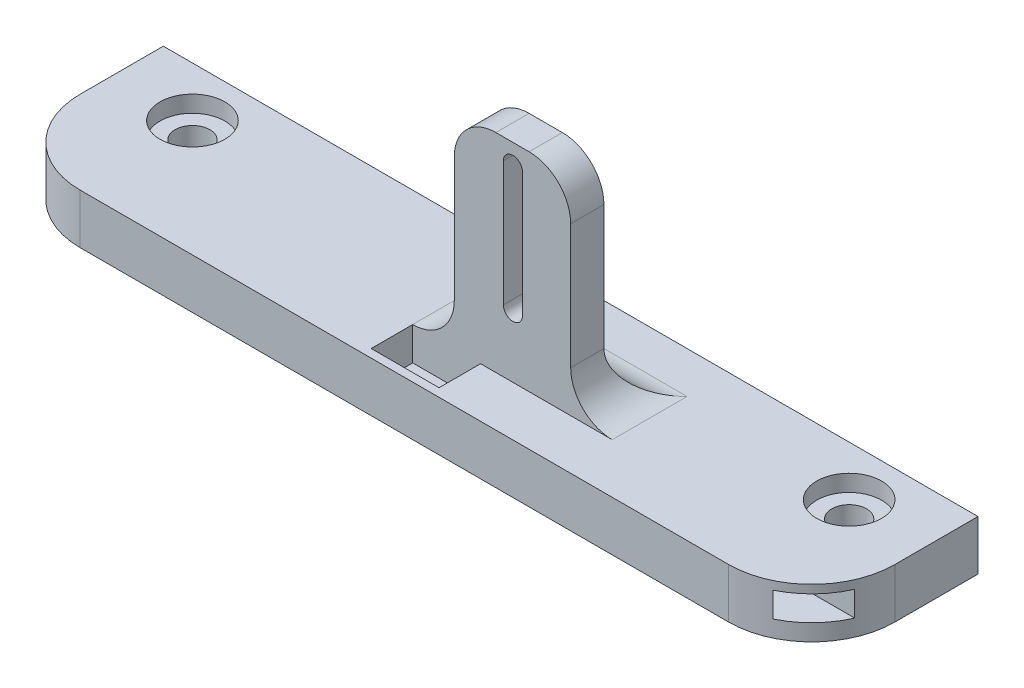
ISO-10303-21;
HEADER;
FILE_DESCRIPTION(('STEP AP214'),'2;1');
FILE_NAME('part.step','',(''),(''),'','','');
FILE_SCHEMA(('AUTOMOTIVE_DESIGN { 1 0 10303 214 1 1 1 1 }'));
ENDSEC;
DATA;
#1=APPLICATION_CONTEXT('core data for automotive mechanical design processes');
#2=APPLICATION_PROTOCOL_DEFINITION('international standard','automotive_design',2000,#1);
#3=PRODUCT_CONTEXT('',#1,'mechanical');
#4=PRODUCT('Part','Part','',(#3));
#5=PRODUCT_RELATED_PRODUCT_CATEGORY('part','',(#4));
#6=PRODUCT_DEFINITION_FORMATION('','',#4);
#7=PRODUCT_DEFINITION_CONTEXT('part definition',#1,'design');
#8=PRODUCT_DEFINITION('design','',#6,#7);
#9=PRODUCT_DEFINITION_SHAPE('','',#8);
#10=(LENGTH_UNIT() NAMED_UNIT(*) SI_UNIT(.MILLI.,.METRE.));
#11=(NAMED_UNIT(*) PLANE_ANGLE_UNIT() SI_UNIT($,.RADIAN.));
#12=(NAMED_UNIT(*) SI_UNIT($,.STERADIAN.) SOLID_ANGLE_UNIT());
#13=UNCERTAINTY_MEASURE_WITH_UNIT(LENGTH_MEASURE(1.E-05),#10,'distance_accuracy_value','');
#14=(GEOMETRIC_REPRESENTATION_CONTEXT(3) GLOBAL_UNCERTAINTY_ASSIGNED_CONTEXT((#13)) GLOBAL_UNIT_ASSIGNED_CONTEXT((#10,
#11,#12)) REPRESENTATION_CONTEXT('',''));
#15=CARTESIAN_POINT('',(0.,0.,0.));
#16=DIRECTION('',(0.,0.,1.));
#17=DIRECTION('',(1.,0.,0.));
#18=AXIS2_PLACEMENT_3D('',#15,#16,#17);
#19=CARTESIAN_POINT('',(48.1651513899117,5.00340782826925,8.99999999999998));
#20=DIRECTION('',(0.,1.,0.));
#21=DIRECTION('',(-1.,0.,0.));
#22=AXIS2_PLACEMENT_3D('',#19,#20,#21);
#23=PLANE('',#22);
#24=DIRECTION('',(1.,0.,0.));
#25=VECTOR('',#24,1.);
#26=CARTESIAN_POINT('',(48.1651513899117,5.00340782826925,3.99999999999999));
#27=LINE('',#26,#25);
#28=CARTESIAN_POINT('',(3.16515138991173,5.00340782826924,3.99999999999999));
#29=VERTEX_POINT('',#28);
#30=CARTESIAN_POINT('',(48.1651513899117,5.00340782826925,3.99999999999993));
#31=VERTEX_POINT('',#30);
#32=EDGE_CURVE('E200',#29,#31,#27,.T.);
#33=ORIENTED_EDGE('',*,*,#32,.T.);
#34=CARTESIAN_POINT('',(39.,5.00340782826925,0.));
#35=DIRECTION('',(0.,1.,0.));
#36=DIRECTION('',(-1.,0.,0.));
#37=AXIS2_PLACEMENT_3D('',#34,#35,#36);
#38=CIRCLE('',#37,10.);
#39=CARTESIAN_POINT('',(43.3588989435407,5.00340782826925,8.99999999999997));
#40=VERTEX_POINT('',#39);
#41=EDGE_CURVE('E54',#31,#40,#38,.F.);
#42=ORIENTED_EDGE('',*,*,#41,.T.);
#43=DIRECTION('',(1.,0.,0.));
#44=VECTOR('',#43,1.);
#45=CARTESIAN_POINT('',(48.1651513899117,5.00340782826925,8.99999999999998));
#46=LINE('',#45,#44);
#47=CARTESIAN_POINT('',(3.16515138991173,5.00340782826924,8.99999999999998));
#48=VERTEX_POINT('',#47);
#49=EDGE_CURVE('E198',#48,#40,#46,.T.);
#50=ORIENTED_EDGE('',*,*,#49,.F.);
#51=DIRECTION('',(0.,0.,-1.));
#52=VECTOR('',#51,1.);
#53=CARTESIAN_POINT('',(3.16515138991173,5.00340782826924,8.99999999999998));
#54=LINE('',#53,#52);
#55=EDGE_CURVE('E212',#48,#29,#54,.T.);
#56=ORIENTED_EDGE('',*,*,#55,.T.);
#57=EDGE_LOOP('',(#33,#42,#50,#56));
#58=FACE_BOUND('',#57,.T.);
#59=ADVANCED_FACE('F39',(#58),#23,.F.);
#60=CARTESIAN_POINT('',(14.,31.,3.99999999999999));
#61=DIRECTION('',(0.,0.,-1.));
#62=DIRECTION('',(-1.,0.,0.));
#63=AXIS2_PLACEMENT_3D('',#60,#61,#62);
#64=PLANE('',#63);
#65=DIRECTION('',(0.,1.,0.));
#66=VECTOR('',#65,1.);
#67=CARTESIAN_POINT('',(5.9,28.5,3.9999999999999));
#68=LINE('',#67,#66);
#69=CARTESIAN_POINT('',(5.9,13.5,3.9999999999999));
#70=VERTEX_POINT('',#69);
#71=CARTESIAN_POINT('',(5.9,28.5,3.9999999999999));
#72=VERTEX_POINT('',#71);
#73=EDGE_CURVE('E406',#70,#72,#68,.T.);
#74=ORIENTED_EDGE('',*,*,#73,.T.);
#75=CARTESIAN_POINT('',(7.05000000000001,28.5,3.9999999999999));
#76=DIRECTION('',(0.,0.,-1.));
#77=DIRECTION('',(-1.,0.,0.));
#78=AXIS2_PLACEMENT_3D('',#75,#76,#77);
#79=CIRCLE('',#78,1.15);
#80=CARTESIAN_POINT('',(8.2,28.5,3.9999999999999));
#81=VERTEX_POINT('',#80);
#82=EDGE_CURVE('E418',#72,#81,#79,.T.);
#83=ORIENTED_EDGE('',*,*,#82,.T.);
#84=DIRECTION('',(0.,-1.,0.));
#85=VECTOR('',#84,1.);
#86=CARTESIAN_POINT('',(8.2,28.5,3.9999999999999));
#87=LINE('',#86,#85);
#88=CARTESIAN_POINT('',(8.2,13.5,3.99999999999999));
#89=VERTEX_POINT('',#88);
#90=EDGE_CURVE('E437',#81,#89,#87,.T.);
#91=ORIENTED_EDGE('',*,*,#90,.T.);
#92=CARTESIAN_POINT('',(7.05,13.5,3.9999999999999));
#93=DIRECTION('',(0.,0.,-1.));
#94=DIRECTION('',(-1.,0.,0.));
#95=AXIS2_PLACEMENT_3D('',#92,#93,#94);
#96=CIRCLE('',#95,1.15);
#97=EDGE_CURVE('E433',#89,#70,#96,.T.);
#98=ORIENTED_EDGE('',*,*,#97,.T.);
#99=EDGE_LOOP('',(#74,#83,#91,#98));
#100=FACE_BOUND('',#99,.T.);
#101=DIRECTION('',(-1.,0.,0.));
#102=VECTOR('',#101,1.);
#103=CARTESIAN_POINT('',(3.16515138991173,6.,3.99999999999999));
#104=LINE('',#103,#102);
#105=CARTESIAN_POINT('',(19.,6.,3.99999999999999));
#106=VERTEX_POINT('',#105);
#107=CARTESIAN_POINT('',(3.16515138991173,6.,3.99999999999999));
#108=VERTEX_POINT('',#107);
#109=EDGE_CURVE('E203',#106,#108,#104,.T.);
#110=ORIENTED_EDGE('',*,*,#109,.F.);
#111=CARTESIAN_POINT('',(19.,11.,3.99999999999999));
#112=DIRECTION('',(0.,0.,-1.));
#113=DIRECTION('',(-1.,0.,0.));
#114=AXIS2_PLACEMENT_3D('',#111,#112,#113);
#115=CIRCLE('',#114,5.);
#116=CARTESIAN_POINT('',(14.,11.,3.99999999999999));
#117=VERTEX_POINT('',#116);
#118=EDGE_CURVE('E259',#117,#106,#115,.F.);
#119=ORIENTED_EDGE('',*,*,#118,.F.);
#120=DIRECTION('',(0.,-1.,0.));
#121=VECTOR('',#120,1.);
#122=CARTESIAN_POINT('',(14.,31.,3.99999999999999));
#123=LINE('',#122,#121);
#124=CARTESIAN_POINT('',(14.,26.,3.99999999999999));
#125=VERTEX_POINT('',#124);
#126=EDGE_CURVE('E387',#125,#117,#123,.T.);
#127=ORIENTED_EDGE('',*,*,#126,.F.);
#128=CARTESIAN_POINT('',(8.99999999999999,26.,3.99999999999999));
#129=DIRECTION('',(0.,0.,-1.));
#130=DIRECTION('',(-1.,0.,0.));
#131=AXIS2_PLACEMENT_3D('',#128,#129,#130);
#132=CIRCLE('',#131,5.);
#133=CARTESIAN_POINT('',(8.99999999999999,31.,3.99999999999999));
#134=VERTEX_POINT('',#133);
#135=EDGE_CURVE('E238',#125,#134,#132,.F.);
#136=ORIENTED_EDGE('',*,*,#135,.T.);
#137=DIRECTION('',(1.,0.,0.));
#138=VECTOR('',#137,1.);
#139=CARTESIAN_POINT('',(14.,31.,3.99999999999999));
#140=LINE('',#139,#138);
#141=CARTESIAN_POINT('',(5.,31.,3.99999999999999));
#142=VERTEX_POINT('',#141);
#143=EDGE_CURVE('E393',#142,#134,#140,.T.);
#144=ORIENTED_EDGE('',*,*,#143,.F.);
#145=CARTESIAN_POINT('',(5.,26.,3.99999999999999));
#146=DIRECTION('',(0.,0.,-1.));
#147=DIRECTION('',(-1.,0.,0.));
#148=AXIS2_PLACEMENT_3D('',#145,#146,#147);
#149=CIRCLE('',#148,5.);
#150=CARTESIAN_POINT('',(0.,26.,3.99999999999999));
#151=VERTEX_POINT('',#150);
#152=EDGE_CURVE('E218',#142,#151,#149,.F.);
#153=ORIENTED_EDGE('',*,*,#152,.T.);
#154=DIRECTION('',(0.,-1.,0.));
#155=VECTOR('',#154,1.);
#156=CARTESIAN_POINT('',(0.,31.,3.99999999999999));
#157=LINE('',#156,#155);
#158=CARTESIAN_POINT('',(0.,11.,3.99999999999999));
#159=VERTEX_POINT('',#158);
#160=EDGE_CURVE('E383',#151,#159,#157,.T.);
#161=ORIENTED_EDGE('',*,*,#160,.T.);
#162=CARTESIAN_POINT('',(-5.,11.,3.99999999999999));
#163=DIRECTION('',(0.,0.,-1.));
#164=DIRECTION('',(-1.,0.,0.));
#165=AXIS2_PLACEMENT_3D('',#162,#163,#164);
#166=CIRCLE('',#165,5.);
#167=CARTESIAN_POINT('',(-5.00000000000001,6.,3.99999999999993));
#168=VERTEX_POINT('',#167);
#169=EDGE_CURVE('E250',#168,#159,#166,.F.);
#170=ORIENTED_EDGE('',*,*,#169,.F.);
#171=DIRECTION('',(0.,1.,0.));
#172=VECTOR('',#171,1.);
#173=CARTESIAN_POINT('',(-5.00000000000001,10.,3.99999999999993));
#174=LINE('',#173,#172);
#175=CARTESIAN_POINT('',(-5.00000000000001,2.,3.99999999999993));
#176=VERTEX_POINT('',#175);
#177=EDGE_CURVE('E464',#176,#168,#174,.T.);
#178=ORIENTED_EDGE('',*,*,#177,.F.);
#179=DIRECTION('',(1.,0.,0.));
#180=VECTOR('',#179,1.);
#181=CARTESIAN_POINT('',(-5.00000000000001,2.,3.99999999999993));
#182=LINE('',#181,#180);
#183=CARTESIAN_POINT('',(48.1651513899117,2.,3.99999999999993));
#184=VERTEX_POINT('',#183);
#185=EDGE_CURVE('E450',#176,#184,#182,.T.);
#186=ORIENTED_EDGE('',*,*,#185,.T.);
#187=DIRECTION('',(0.,-1.,0.));
#188=VECTOR('',#187,1.);
#189=CARTESIAN_POINT('',(48.1651513899117,6.,3.99999999999993));
#190=LINE('',#189,#188);
#191=EDGE_CURVE('E11',#31,#184,#190,.T.);
#192=ORIENTED_EDGE('',*,*,#191,.F.);
#193=ORIENTED_EDGE('',*,*,#32,.F.);
#194=DIRECTION('',(0.,-1.,0.));
#195=VECTOR('',#194,1.);
#196=CARTESIAN_POINT('',(3.16515138991173,5.00340782826924,3.99999999999999));
#197=LINE('',#196,#195);
#198=EDGE_CURVE('E475',#108,#29,#197,.T.);
#199=ORIENTED_EDGE('',*,*,#198,.F.);
#200=EDGE_LOOP('',(#110,#119,#127,#136,#144,#153,#161,#170,#178,#186,#192,#193,#199));
#201=FACE_BOUND('',#200,.T.);
#202=ADVANCED_FACE('F491',(#100,#201),#64,.F.);
#203=CARTESIAN_POINT('',(-5.00000000000001,10.,8.99999999999993));
#204=DIRECTION('',(0.,0.,1.));
#205=DIRECTION('',(0.,-1.,0.));
#206=AXIS2_PLACEMENT_3D('',#203,#204,#205);
#207=PLANE('',#206);
#208=DIRECTION('',(0.,-1.,0.));
#209=VECTOR('',#208,1.);
#210=CARTESIAN_POINT('',(3.16515138991173,5.00340782826924,8.99999999999998));
#211=LINE('',#210,#209);
#212=CARTESIAN_POINT('',(3.16515138991173,6.,8.99999999999993));
#213=VERTEX_POINT('',#212);
#214=EDGE_CURVE('E209',#213,#48,#211,.T.);
#215=ORIENTED_EDGE('',*,*,#214,.T.);
#216=ORIENTED_EDGE('',*,*,#49,.T.);
#217=DIRECTION('',(0.,-1.,0.));
#218=VECTOR('',#217,1.);
#219=CARTESIAN_POINT('',(43.3588989435408,6.,8.99999999999993));
#220=LINE('',#219,#218);
#221=CARTESIAN_POINT('',(43.3588989435408,2.,8.99999999999993));
#222=VERTEX_POINT('',#221);
#223=EDGE_CURVE('E207',#222,#40,#220,.F.);
#224=ORIENTED_EDGE('',*,*,#223,.F.);
#225=DIRECTION('',(1.,0.,0.));
#226=VECTOR('',#225,1.);
#227=CARTESIAN_POINT('',(-5.00000000000001,2.,8.99999999999993));
#228=LINE('',#227,#226);
#229=CARTESIAN_POINT('',(-5.00000000000001,2.,8.99999999999993));
#230=VERTEX_POINT('',#229);
#231=EDGE_CURVE('E451',#230,#222,#228,.T.);
#232=ORIENTED_EDGE('',*,*,#231,.F.);
#233=DIRECTION('',(0.,-1.,0.));
#234=VECTOR('',#233,1.);
#235=CARTESIAN_POINT('',(-5.00000000000001,10.,8.99999999999993));
#236=LINE('',#235,#234);
#237=CARTESIAN_POINT('',(-5.00000000000001,6.,8.99999999999993));
#238=VERTEX_POINT('',#237);
#239=EDGE_CURVE('E461',#238,#230,#236,.T.);
#240=ORIENTED_EDGE('',*,*,#239,.F.);
#241=DIRECTION('',(-1.,0.,0.));
#242=VECTOR('',#241,1.);
#243=CARTESIAN_POINT('',(-39.,6.,8.99999999999993));
#244=LINE('',#243,#242);
#245=EDGE_CURVE('E62',#213,#238,#244,.T.);
#246=ORIENTED_EDGE('',*,*,#245,.F.);
#247=EDGE_LOOP('',(#215,#216,#224,#232,#240,#246));
#248=FACE_BOUND('',#247,.T.);
#249=ADVANCED_FACE('F205',(#248),#207,.F.);
#250=CARTESIAN_POINT('',(5.,26.,0.));
#251=DIRECTION('',(0.,0.,1.));
#252=DIRECTION('',(1.,0.,0.));
#253=AXIS2_PLACEMENT_3D('',#250,#251,#252);
#254=CYLINDRICAL_SURFACE('',#253,5.);
#255=DIRECTION('',(0.,0.,1.));
#256=VECTOR('',#255,1.);
#257=CARTESIAN_POINT('',(5.,31.,0.));
#258=LINE('',#257,#256);
#259=CARTESIAN_POINT('',(5.,31.,0.));
#260=VERTEX_POINT('',#259);
#261=EDGE_CURVE('E231',#260,#142,#258,.T.);
#262=ORIENTED_EDGE('',*,*,#261,.F.);
#263=CARTESIAN_POINT('',(5.,26.,0.));
#264=DIRECTION('',(0.,0.,1.));
#265=DIRECTION('',(1.,0.,0.));
#266=AXIS2_PLACEMENT_3D('',#263,#264,#265);
#267=CIRCLE('',#266,5.);
#268=CARTESIAN_POINT('',(0.,26.,0.));
#269=VERTEX_POINT('',#268);
#270=EDGE_CURVE('E222',#269,#260,#267,.F.);
#271=ORIENTED_EDGE('',*,*,#270,.F.);
#272=DIRECTION('',(0.,0.,1.));
#273=VECTOR('',#272,1.);
#274=CARTESIAN_POINT('',(0.,26.,3.99999999999999));
#275=LINE('',#274,#273);
#276=EDGE_CURVE('E227',#151,#269,#275,.F.);
#277=ORIENTED_EDGE('',*,*,#276,.F.);
#278=ORIENTED_EDGE('',*,*,#152,.F.);
#279=EDGE_LOOP('',(#262,#271,#277,#278));
#280=FACE_BOUND('',#279,.T.);
#281=ADVANCED_FACE('F41',(#280),#254,.T.);
#282=CARTESIAN_POINT('',(9.,26.,0.));
#283=DIRECTION('',(0.,0.,-1.));
#284=DIRECTION('',(-1.,0.,0.));
#285=AXIS2_PLACEMENT_3D('',#282,#283,#284);
#286=CYLINDRICAL_SURFACE('',#285,5.);
#287=DIRECTION('',(0.,0.,-1.));
#288=VECTOR('',#287,1.);
#289=CARTESIAN_POINT('',(9.,31.,0.));
#290=LINE('',#289,#288);
#291=CARTESIAN_POINT('',(9.,31.,0.));
#292=VERTEX_POINT('',#291);
#293=EDGE_CURVE('E246',#134,#292,#290,.T.);
#294=ORIENTED_EDGE('',*,*,#293,.F.);
#295=ORIENTED_EDGE('',*,*,#135,.F.);
#296=DIRECTION('',(0.,0.,-1.));
#297=VECTOR('',#296,1.);
#298=CARTESIAN_POINT('',(14.,26.,0.));
#299=LINE('',#298,#297);
#300=CARTESIAN_POINT('',(14.,26.,0.));
#301=VERTEX_POINT('',#300);
#302=EDGE_CURVE('E242',#301,#125,#299,.F.);
#303=ORIENTED_EDGE('',*,*,#302,.F.);
#304=CARTESIAN_POINT('',(9.,26.,0.));
#305=DIRECTION('',(0.,0.,1.));
#306=DIRECTION('',(1.,0.,0.));
#307=AXIS2_PLACEMENT_3D('',#304,#305,#306);
#308=CIRCLE('',#307,5.);
#309=EDGE_CURVE('E235',#292,#301,#308,.F.);
#310=ORIENTED_EDGE('',*,*,#309,.F.);
#311=EDGE_LOOP('',(#294,#295,#303,#310));
#312=FACE_BOUND('',#311,.T.);
#313=ADVANCED_FACE('F522',(#312),#286,.T.);
#314=CARTESIAN_POINT('',(0.,11.,-5.));
#315=DIRECTION('',(1.,0.,0.));
#316=DIRECTION('',(0.,0.,-1.));
#317=AXIS2_PLACEMENT_3D('',#314,#315,#316);
#318=CYLINDRICAL_SURFACE('',#317,5.);
#319=CARTESIAN_POINT('',(-5.00000000000001,11.,-5.));
#320=DIRECTION('',(0.707106781186547,0.,-0.707106781186548));
#321=DIRECTION('',(-0.707106781186548,0.,-0.707106781186547));
#322=AXIS2_PLACEMENT_3D('',#319,#320,#321);
#323=ELLIPSE('',#322,7.07106781186548,5.);
#324=CARTESIAN_POINT('',(0.,11.,0.));
#325=VERTEX_POINT('',#324);
#326=CARTESIAN_POINT('',(-5.00000000000001,6.,-5.));
#327=VERTEX_POINT('',#326);
#328=EDGE_CURVE('E253',#325,#327,#323,.T.);
#329=ORIENTED_EDGE('',*,*,#328,.F.);
#330=DIRECTION('',(-1.,0.,0.));
#331=VECTOR('',#330,1.);
#332=CARTESIAN_POINT('',(0.,11.,0.));
#333=LINE('',#332,#331);
#334=CARTESIAN_POINT('',(14.,11.,0.));
#335=VERTEX_POINT('',#334);
#336=EDGE_CURVE('E267',#335,#325,#333,.T.);
#337=ORIENTED_EDGE('',*,*,#336,.F.);
#338=CARTESIAN_POINT('',(19.,11.,-5.));
#339=DIRECTION('',(0.707106781186547,0.,0.707106781186548));
#340=DIRECTION('',(0.707106781186548,0.,-0.707106781186547));
#341=AXIS2_PLACEMENT_3D('',#338,#339,#340);
#342=ELLIPSE('',#341,7.07106781186549,5.);
#343=CARTESIAN_POINT('',(19.,6.,-5.));
#344=VERTEX_POINT('',#343);
#345=EDGE_CURVE('E256',#335,#344,#342,.T.);
#346=ORIENTED_EDGE('',*,*,#345,.T.);
#347=DIRECTION('',(-1.,0.,0.));
#348=VECTOR('',#347,1.);
#349=CARTESIAN_POINT('',(0.,6.,-5.));
#350=LINE('',#349,#348);
#351=EDGE_CURVE('E275',#327,#344,#350,.F.);
#352=ORIENTED_EDGE('',*,*,#351,.F.);
#353=EDGE_LOOP('',(#329,#337,#346,#352));
#354=FACE_BOUND('',#353,.T.);
#355=ADVANCED_FACE('F509',(#354),#318,.F.);
#356=CARTESIAN_POINT('',(19.,11.,0.));
#357=DIRECTION('',(0.,0.,1.));
#358=DIRECTION('',(1.,0.,0.));
#359=AXIS2_PLACEMENT_3D('',#356,#357,#358);
#360=CYLINDRICAL_SURFACE('',#359,5.);
#361=ORIENTED_EDGE('',*,*,#345,.F.);
#362=DIRECTION('',(0.,0.,-1.));
#363=VECTOR('',#362,1.);
#364=CARTESIAN_POINT('',(14.,11.,0.));
#365=LINE('',#364,#363);
#366=EDGE_CURVE('E283',#117,#335,#365,.T.);
#367=ORIENTED_EDGE('',*,*,#366,.F.);
#368=ORIENTED_EDGE('',*,*,#118,.T.);
#369=DIRECTION('',(0.,0.,-1.));
#370=VECTOR('',#369,1.);
#371=CARTESIAN_POINT('',(19.,6.,0.));
#372=LINE('',#371,#370);
#373=EDGE_CURVE('E271',#344,#106,#372,.F.);
#374=ORIENTED_EDGE('',*,*,#373,.F.);
#375=EDGE_LOOP('',(#361,#367,#368,#374));
#376=FACE_BOUND('',#375,.T.);
#377=ADVANCED_FACE('F513',(#376),#360,.F.);
#378=CARTESIAN_POINT('',(-5.,11.,3.99999999999999));
#379=DIRECTION('',(0.,0.,-1.));
#380=DIRECTION('',(-1.,0.,0.));
#381=AXIS2_PLACEMENT_3D('',#378,#379,#380);
#382=CYLINDRICAL_SURFACE('',#381,5.);
#383=DIRECTION('',(0.,0.,1.));
#384=VECTOR('',#383,1.);
#385=CARTESIAN_POINT('',(0.,11.,3.99999999999999));
#386=LINE('',#385,#384);
#387=EDGE_CURVE('E263',#325,#159,#386,.T.);
#388=ORIENTED_EDGE('',*,*,#387,.F.);
#389=ORIENTED_EDGE('',*,*,#328,.T.);
#390=DIRECTION('',(0.,0.,1.));
#391=VECTOR('',#390,1.);
#392=CARTESIAN_POINT('',(-5.,6.,3.99999999999999));
#393=LINE('',#392,#391);
#394=EDGE_CURVE('E279',#168,#327,#393,.F.);
#395=ORIENTED_EDGE('',*,*,#394,.F.);
#396=ORIENTED_EDGE('',*,*,#169,.T.);
#397=EDGE_LOOP('',(#388,#389,#395,#396));
#398=FACE_BOUND('',#397,.T.);
#399=ADVANCED_FACE('F504',(#398),#382,.F.);
#400=CARTESIAN_POINT('',(-39.,6.,0.));
#401=DIRECTION('',(0.,-1.,0.));
#402=DIRECTION('',(0.,0.,-1.));
#403=AXIS2_PLACEMENT_3D('',#400,#401,#402);
#404=PLANE('',#403);
#405=CARTESIAN_POINT('',(39.,6.,0.));
#406=DIRECTION('',(0.,1.,0.));
#407=DIRECTION('',(0.,0.,1.));
#408=AXIS2_PLACEMENT_3D('',#405,#406,#407);
#409=CIRCLE('',#408,10.);
#410=CARTESIAN_POINT('',(38.9999999999999,6.,9.99999999999999));
#411=VERTEX_POINT('',#410);
#412=CARTESIAN_POINT('',(49.,6.,0.));
#413=VERTEX_POINT('',#412);
#414=EDGE_CURVE('E318',#411,#413,#409,.T.);
#415=ORIENTED_EDGE('',*,*,#414,.T.);
#416=DIRECTION('',(0.,0.,-1.));
#417=VECTOR('',#416,1.);
#418=CARTESIAN_POINT('',(49.,6.,0.));
#419=LINE('',#418,#417);
#420=CARTESIAN_POINT('',(49.,6.,-10.));
#421=VERTEX_POINT('',#420);
#422=EDGE_CURVE('E323',#413,#421,#419,.T.);
#423=ORIENTED_EDGE('',*,*,#422,.T.);
#424=DIRECTION('',(-1.,0.,0.));
#425=VECTOR('',#424,1.);
#426=CARTESIAN_POINT('',(-49.,6.,-10.));
#427=LINE('',#426,#425);
#428=CARTESIAN_POINT('',(-49.,6.,-10.));
#429=VERTEX_POINT('',#428);
#430=EDGE_CURVE('E353',#421,#429,#427,.T.);
#431=ORIENTED_EDGE('',*,*,#430,.T.);
#432=DIRECTION('',(0.,0.,1.));
#433=VECTOR('',#432,1.);
#434=CARTESIAN_POINT('',(-49.,6.,0.));
#435=LINE('',#434,#433);
#436=CARTESIAN_POINT('',(-49.,6.,0.));
#437=VERTEX_POINT('',#436);
#438=EDGE_CURVE('E350',#429,#437,#435,.T.);
#439=ORIENTED_EDGE('',*,*,#438,.T.);
#440=CARTESIAN_POINT('',(-39.,6.,0.));
#441=DIRECTION('',(0.,1.,0.));
#442=DIRECTION('',(0.,0.,-1.));
#443=AXIS2_PLACEMENT_3D('',#440,#441,#442);
#444=CIRCLE('',#443,10.);
#445=CARTESIAN_POINT('',(-38.9999999999999,6.,9.99999999999999));
#446=VERTEX_POINT('',#445);
#447=EDGE_CURVE('E347',#437,#446,#444,.T.);
#448=ORIENTED_EDGE('',*,*,#447,.T.);
#449=DIRECTION('',(1.,0.,0.));
#450=VECTOR('',#449,1.);
#451=CARTESIAN_POINT('',(-38.9999999999999,6.,9.99999999999999));
#452=LINE('',#451,#450);
#453=EDGE_CURVE('E344',#446,#411,#452,.T.);
#454=ORIENTED_EDGE('',*,*,#453,.T.);
#455=EDGE_LOOP('',(#415,#423,#431,#439,#448,#454));
#456=FACE_BOUND('',#455,.T.);
#457=ORIENTED_EDGE('',*,*,#373,.T.);
#458=ORIENTED_EDGE('',*,*,#109,.T.);
#459=DIRECTION('',(0.,0.,-1.));
#460=VECTOR('',#459,1.);
#461=CARTESIAN_POINT('',(3.16515138991173,6.,8.99999999999998));
#462=LINE('',#461,#460);
#463=EDGE_CURVE('E467',#213,#108,#462,.T.);
#464=ORIENTED_EDGE('',*,*,#463,.F.);
#465=ORIENTED_EDGE('',*,*,#245,.T.);
#466=DIRECTION('',(0.,0.,1.));
#467=VECTOR('',#466,1.);
#468=CARTESIAN_POINT('',(-5.00000000000001,6.,0.));
#469=LINE('',#468,#467);
#470=EDGE_CURVE('E446',#168,#238,#469,.T.);
#471=ORIENTED_EDGE('',*,*,#470,.F.);
#472=ORIENTED_EDGE('',*,*,#394,.T.);
#473=ORIENTED_EDGE('',*,*,#351,.T.);
#474=EDGE_LOOP('',(#457,#458,#464,#465,#471,#472,#473));
#475=FACE_BOUND('',#474,.T.);
#476=CARTESIAN_POINT('',(-39.5,6.,-4.00000000000001));
#477=DIRECTION('',(0.,1.,0.));
#478=DIRECTION('',(0.,0.,1.));
#479=AXIS2_PLACEMENT_3D('',#476,#477,#478);
#480=CIRCLE('',#479,3.9);
#481=CARTESIAN_POINT('',(-39.5,6.,-0.100000000000007));
#482=VERTEX_POINT('',#481);
#483=EDGE_CURVE('E365',#482,#482,#480,.T.);
#484=ORIENTED_EDGE('',*,*,#483,.F.);
#485=EDGE_LOOP('',(#484));
#486=FACE_BOUND('',#485,.T.);
#487=CARTESIAN_POINT('',(39.5,6.,-4.00000000000001));
#488=DIRECTION('',(0.,1.,0.));
#489=DIRECTION('',(0.,0.,1.));
#490=AXIS2_PLACEMENT_3D('',#487,#488,#489);
#491=CIRCLE('',#490,3.9);
#492=CARTESIAN_POINT('',(39.5,6.,-0.100000000000007));
#493=VERTEX_POINT('',#492);
#494=EDGE_CURVE('E374',#493,#493,#491,.T.);
#495=ORIENTED_EDGE('',*,*,#494,.F.);
#496=EDGE_LOOP('',(#495));
#497=FACE_BOUND('',#496,.T.);
#498=ADVANCED_FACE('F483',(#456,#475,#486,#497),#404,.F.);
#499=CARTESIAN_POINT('',(-39.5,6.,-4.00000000000001));
#500=DIRECTION('',(0.,-1.,0.));
#501=DIRECTION('',(0.,0.,-1.));
#502=AXIS2_PLACEMENT_3D('',#499,#500,#501);
#503=CYLINDRICAL_SURFACE('',#502,2.1);
#504=CARTESIAN_POINT('',(-39.5,0.,-4.00000000000001));
#505=DIRECTION('',(0.,1.,0.));
#506=DIRECTION('',(0.,0.,1.));
#507=AXIS2_PLACEMENT_3D('',#504,#505,#506);
#508=CIRCLE('',#507,2.1);
#509=CARTESIAN_POINT('',(-39.5,0.,-1.90000000000001));
#510=VERTEX_POINT('',#509);
#511=EDGE_CURVE('E341',#510,#510,#508,.T.);
#512=ORIENTED_EDGE('',*,*,#511,.F.);
#513=EDGE_LOOP('',(#512));
#514=FACE_BOUND('',#513,.T.);
#515=CARTESIAN_POINT('',(-39.5,4.,-4.00000000000001));
#516=DIRECTION('',(0.,1.,0.));
#517=DIRECTION('',(0.,0.,1.));
#518=AXIS2_PLACEMENT_3D('',#515,#516,#517);
#519=CIRCLE('',#518,2.1);
#520=CARTESIAN_POINT('',(-39.5,4.,-1.90000000000001));
#521=VERTEX_POINT('',#520);
#522=EDGE_CURVE('E288',#521,#521,#519,.T.);
#523=ORIENTED_EDGE('',*,*,#522,.T.);
#524=EDGE_LOOP('',(#523));
#525=FACE_BOUND('',#524,.T.);
#526=ADVANCED_FACE('F644',(#514,#525),#503,.F.);
#527=CARTESIAN_POINT('',(39.5,6.,-4.00000000000001));
#528=DIRECTION('',(0.,-1.,0.));
#529=DIRECTION('',(0.,0.,-1.));
#530=AXIS2_PLACEMENT_3D('',#527,#528,#529);
#531=CYLINDRICAL_SURFACE('',#530,2.1);
#532=CARTESIAN_POINT('',(39.5,0.,-4.00000000000001));
#533=DIRECTION('',(0.,1.,0.));
#534=DIRECTION('',(0.,0.,1.));
#535=AXIS2_PLACEMENT_3D('',#532,#533,#534);
#536=CIRCLE('',#535,2.1);
#537=CARTESIAN_POINT('',(39.5,0.,-1.90000000000001));
#538=VERTEX_POINT('',#537);
#539=EDGE_CURVE('E292',#538,#538,#536,.T.);
#540=ORIENTED_EDGE('',*,*,#539,.F.);
#541=EDGE_LOOP('',(#540));
#542=FACE_BOUND('',#541,.T.);
#543=CARTESIAN_POINT('',(39.5,4.,-4.00000000000001));
#544=DIRECTION('',(0.,1.,0.));
#545=DIRECTION('',(0.,0.,1.));
#546=AXIS2_PLACEMENT_3D('',#543,#544,#545);
#547=CIRCLE('',#546,2.1);
#548=CARTESIAN_POINT('',(39.5,4.,-1.90000000000001));
#549=VERTEX_POINT('',#548);
#550=EDGE_CURVE('E293',#549,#549,#547,.T.);
#551=ORIENTED_EDGE('',*,*,#550,.T.);
#552=EDGE_LOOP('',(#551));
#553=FACE_BOUND('',#552,.T.);
#554=ADVANCED_FACE('F794',(#542,#553),#531,.F.);
#555=CARTESIAN_POINT('',(-39.,0.,0.));
#556=DIRECTION('',(0.,-1.,0.));
#557=DIRECTION('',(0.,0.,-1.));
#558=AXIS2_PLACEMENT_3D('',#555,#556,#557);
#559=PLANE('',#558);
#560=ORIENTED_EDGE('',*,*,#511,.T.);
#561=EDGE_LOOP('',(#560));
#562=FACE_BOUND('',#561,.T.);
#563=DIRECTION('',(0.,0.,-1.));
#564=VECTOR('',#563,1.);
#565=CARTESIAN_POINT('',(49.,0.,0.));
#566=LINE('',#565,#564);
#567=CARTESIAN_POINT('',(49.,0.,0.));
#568=VERTEX_POINT('',#567);
#569=CARTESIAN_POINT('',(49.,0.,-10.));
#570=VERTEX_POINT('',#569);
#571=EDGE_CURVE('E337',#568,#570,#566,.T.);
#572=ORIENTED_EDGE('',*,*,#571,.F.);
#573=CARTESIAN_POINT('',(39.,0.,0.));
#574=DIRECTION('',(0.,1.,0.));
#575=DIRECTION('',(0.,0.,1.));
#576=AXIS2_PLACEMENT_3D('',#573,#574,#575);
#577=CIRCLE('',#576,10.);
#578=CARTESIAN_POINT('',(38.9999999999999,0.,9.99999999999999));
#579=VERTEX_POINT('',#578);
#580=EDGE_CURVE('E319',#579,#568,#577,.T.);
#581=ORIENTED_EDGE('',*,*,#580,.F.);
#582=DIRECTION('',(1.,0.,0.));
#583=VECTOR('',#582,1.);
#584=CARTESIAN_POINT('',(-38.9999999999999,0.,9.99999999999999));
#585=LINE('',#584,#583);
#586=CARTESIAN_POINT('',(-38.9999999999999,0.,9.99999999999999));
#587=VERTEX_POINT('',#586);
#588=EDGE_CURVE('E324',#587,#579,#585,.T.);
#589=ORIENTED_EDGE('',*,*,#588,.F.);
#590=CARTESIAN_POINT('',(-39.,0.,0.));
#591=DIRECTION('',(0.,1.,0.));
#592=DIRECTION('',(0.,0.,-1.));
#593=AXIS2_PLACEMENT_3D('',#590,#591,#592);
#594=CIRCLE('',#593,10.);
#595=CARTESIAN_POINT('',(-49.,0.,0.));
#596=VERTEX_POINT('',#595);
#597=EDGE_CURVE('E328',#596,#587,#594,.T.);
#598=ORIENTED_EDGE('',*,*,#597,.F.);
#599=DIRECTION('',(0.,0.,1.));
#600=VECTOR('',#599,1.);
#601=CARTESIAN_POINT('',(-49.,0.,0.));
#602=LINE('',#601,#600);
#603=CARTESIAN_POINT('',(-49.,0.,-10.));
#604=VERTEX_POINT('',#603);
#605=EDGE_CURVE('E331',#604,#596,#602,.T.);
#606=ORIENTED_EDGE('',*,*,#605,.F.);
#607=DIRECTION('',(-1.,0.,0.));
#608=VECTOR('',#607,1.);
#609=CARTESIAN_POINT('',(-49.,0.,-10.));
#610=LINE('',#609,#608);
#611=EDGE_CURVE('E334',#570,#604,#610,.T.);
#612=ORIENTED_EDGE('',*,*,#611,.F.);
#613=EDGE_LOOP('',(#572,#581,#589,#598,#606,#612));
#614=FACE_BOUND('',#613,.T.);
#615=ORIENTED_EDGE('',*,*,#539,.T.);
#616=EDGE_LOOP('',(#615));
#617=FACE_BOUND('',#616,.T.);
#618=ADVANCED_FACE('F659',(#562,#614,#617),#559,.T.);
#619=CARTESIAN_POINT('',(49.,6.,0.));
#620=DIRECTION('',(-1.,0.,0.));
#621=DIRECTION('',(0.,0.,1.));
#622=AXIS2_PLACEMENT_3D('',#619,#620,#621);
#623=PLANE('',#622);
#624=DIRECTION('',(0.,-1.,0.));
#625=VECTOR('',#624,1.);
#626=CARTESIAN_POINT('',(49.,6.,0.));
#627=LINE('',#626,#625);
#628=EDGE_CURVE('E315',#413,#568,#627,.T.);
#629=ORIENTED_EDGE('',*,*,#628,.T.);
#630=ORIENTED_EDGE('',*,*,#571,.T.);
#631=DIRECTION('',(0.,-1.,0.));
#632=VECTOR('',#631,1.);
#633=CARTESIAN_POINT('',(49.,6.,-10.));
#634=LINE('',#633,#632);
#635=EDGE_CURVE('E287',#421,#570,#634,.T.);
#636=ORIENTED_EDGE('',*,*,#635,.F.);
#637=ORIENTED_EDGE('',*,*,#422,.F.);
#638=EDGE_LOOP('',(#629,#630,#636,#637));
#639=FACE_BOUND('',#638,.T.);
#640=ADVANCED_FACE('F653',(#639),#623,.F.);
#641=CARTESIAN_POINT('',(-49.,6.,-10.));
#642=DIRECTION('',(0.,0.,1.));
#643=DIRECTION('',(1.,0.,0.));
#644=AXIS2_PLACEMENT_3D('',#641,#642,#643);
#645=PLANE('',#644);
#646=ORIENTED_EDGE('',*,*,#611,.T.);
#647=DIRECTION('',(0.,-1.,0.));
#648=VECTOR('',#647,1.);
#649=CARTESIAN_POINT('',(-49.,6.,-10.));
#650=LINE('',#649,#648);
#651=EDGE_CURVE('E300',#429,#604,#650,.T.);
#652=ORIENTED_EDGE('',*,*,#651,.F.);
#653=ORIENTED_EDGE('',*,*,#430,.F.);
#654=ORIENTED_EDGE('',*,*,#635,.T.);
#655=EDGE_LOOP('',(#646,#652,#653,#654));
#656=FACE_BOUND('',#655,.T.);
#657=ADVANCED_FACE('F658',(#656),#645,.F.);
#658=CARTESIAN_POINT('',(-49.,6.,0.));
#659=DIRECTION('',(1.,0.,0.));
#660=DIRECTION('',(0.,0.,-1.));
#661=AXIS2_PLACEMENT_3D('',#658,#659,#660);
#662=PLANE('',#661);
#663=ORIENTED_EDGE('',*,*,#605,.T.);
#664=DIRECTION('',(0.,-1.,0.));
#665=VECTOR('',#664,1.);
#666=CARTESIAN_POINT('',(-49.,6.,0.));
#667=LINE('',#666,#665);
#668=EDGE_CURVE('E304',#437,#596,#667,.T.);
#669=ORIENTED_EDGE('',*,*,#668,.F.);
#670=ORIENTED_EDGE('',*,*,#438,.F.);
#671=ORIENTED_EDGE('',*,*,#651,.T.);
#672=EDGE_LOOP('',(#663,#669,#670,#671));
#673=FACE_BOUND('',#672,.T.);
#674=ADVANCED_FACE('F671',(#673),#662,.F.);
#675=CARTESIAN_POINT('',(-39.,6.,0.));
#676=DIRECTION('',(0.,-1.,0.));
#677=DIRECTION('',(0.,0.,-1.));
#678=AXIS2_PLACEMENT_3D('',#675,#676,#677);
#679=CYLINDRICAL_SURFACE('',#678,10.);
#680=ORIENTED_EDGE('',*,*,#597,.T.);
#681=DIRECTION('',(0.,-1.,0.));
#682=VECTOR('',#681,1.);
#683=CARTESIAN_POINT('',(-38.9999999999999,6.,9.99999999999999));
#684=LINE('',#683,#682);
#685=EDGE_CURVE('E308',#446,#587,#684,.T.);
#686=ORIENTED_EDGE('',*,*,#685,.F.);
#687=ORIENTED_EDGE('',*,*,#447,.F.);
#688=ORIENTED_EDGE('',*,*,#668,.T.);
#689=EDGE_LOOP('',(#680,#686,#687,#688));
#690=FACE_BOUND('',#689,.T.);
#691=ADVANCED_FACE('F684',(#690),#679,.T.);
#692=CARTESIAN_POINT('',(-38.9999999999999,6.,9.99999999999999));
#693=DIRECTION('',(0.,0.,-1.));
#694=DIRECTION('',(-1.,0.,0.));
#695=AXIS2_PLACEMENT_3D('',#692,#693,#694);
#696=PLANE('',#695);
#697=DIRECTION('',(0.,-1.,0.));
#698=VECTOR('',#697,1.);
#699=CARTESIAN_POINT('',(38.9999999999999,6.,9.99999999999999));
#700=LINE('',#699,#698);
#701=EDGE_CURVE('E312',#411,#579,#700,.T.);
#702=ORIENTED_EDGE('',*,*,#701,.F.);
#703=ORIENTED_EDGE('',*,*,#453,.F.);
#704=ORIENTED_EDGE('',*,*,#685,.T.);
#705=ORIENTED_EDGE('',*,*,#588,.T.);
#706=EDGE_LOOP('',(#702,#703,#704,#705));
#707=FACE_BOUND('',#706,.T.);
#708=ADVANCED_FACE('F679',(#707),#696,.F.);
#709=CARTESIAN_POINT('',(39.,6.,0.));
#710=DIRECTION('',(0.,-1.,0.));
#711=DIRECTION('',(0.,0.,-1.));
#712=AXIS2_PLACEMENT_3D('',#709,#710,#711);
#713=CYLINDRICAL_SURFACE('',#712,10.);
#714=ORIENTED_EDGE('',*,*,#628,.F.);
#715=ORIENTED_EDGE('',*,*,#414,.F.);
#716=ORIENTED_EDGE('',*,*,#701,.T.);
#717=ORIENTED_EDGE('',*,*,#580,.T.);
#718=EDGE_LOOP('',(#714,#715,#716,#717));
#719=FACE_BOUND('',#718,.T.);
#720=ORIENTED_EDGE('',*,*,#223,.T.);
#721=ORIENTED_EDGE('',*,*,#41,.F.);
#722=ORIENTED_EDGE('',*,*,#191,.T.);
#723=CARTESIAN_POINT('',(39.,2.,0.));
#724=DIRECTION('',(0.,-1.,0.));
#725=DIRECTION('',(0.,0.,-1.));
#726=AXIS2_PLACEMENT_3D('',#723,#724,#725);
#727=CIRCLE('',#726,10.);
#728=EDGE_CURVE('E48',#184,#222,#727,.T.);
#729=ORIENTED_EDGE('',*,*,#728,.T.);
#730=EDGE_LOOP('',(#720,#721,#722,#729));
#731=FACE_BOUND('',#730,.T.);
#732=ADVANCED_FACE('F215',(#719,#731),#713,.T.);
#733=CARTESIAN_POINT('',(39.5,4.,-4.00000000000001));
#734=DIRECTION('',(0.,1.,0.));
#735=DIRECTION('',(0.,0.,1.));
#736=AXIS2_PLACEMENT_3D('',#733,#734,#735);
#737=CYLINDRICAL_SURFACE('',#736,3.9);
#738=CARTESIAN_POINT('',(39.5,4.,-4.00000000000001));
#739=DIRECTION('',(0.,1.,0.));
#740=DIRECTION('',(0.,0.,1.));
#741=AXIS2_PLACEMENT_3D('',#738,#739,#740);
#742=CIRCLE('',#741,3.9);
#743=CARTESIAN_POINT('',(39.5,4.,-0.100000000000007));
#744=VERTEX_POINT('',#743);
#745=EDGE_CURVE('E297',#744,#744,#742,.T.);
#746=ORIENTED_EDGE('',*,*,#745,.F.);
#747=EDGE_LOOP('',(#746));
#748=FACE_BOUND('',#747,.T.);
#749=ORIENTED_EDGE('',*,*,#494,.T.);
#750=EDGE_LOOP('',(#749));
#751=FACE_BOUND('',#750,.T.);
#752=ADVANCED_FACE('F695',(#748,#751),#737,.F.);
#753=CARTESIAN_POINT('',(39.5,4.,-4.00000000000001));
#754=DIRECTION('',(0.,1.,0.));
#755=DIRECTION('',(0.,0.,1.));
#756=AXIS2_PLACEMENT_3D('',#753,#754,#755);
#757=PLANE('',#756);
#758=ORIENTED_EDGE('',*,*,#550,.F.);
#759=EDGE_LOOP('',(#758));
#760=FACE_BOUND('',#759,.T.);
#761=ORIENTED_EDGE('',*,*,#745,.T.);
#762=EDGE_LOOP('',(#761));
#763=FACE_BOUND('',#762,.T.);
#764=ADVANCED_FACE('F705',(#760,#763),#757,.T.);
#765=CARTESIAN_POINT('',(-39.5,4.,-4.00000000000001));
#766=DIRECTION('',(0.,1.,0.));
#767=DIRECTION('',(0.,0.,1.));
#768=AXIS2_PLACEMENT_3D('',#765,#766,#767);
#769=CYLINDRICAL_SURFACE('',#768,3.9);
#770=CARTESIAN_POINT('',(-39.5,4.,-4.00000000000001));
#771=DIRECTION('',(0.,1.,0.));
#772=DIRECTION('',(0.,0.,1.));
#773=AXIS2_PLACEMENT_3D('',#770,#771,#772);
#774=CIRCLE('',#773,3.9);
#775=CARTESIAN_POINT('',(-39.5,4.,-0.100000000000007));
#776=VERTEX_POINT('',#775);
#777=EDGE_CURVE('E369',#776,#776,#774,.T.);
#778=ORIENTED_EDGE('',*,*,#777,.F.);
#779=EDGE_LOOP('',(#778));
#780=FACE_BOUND('',#779,.T.);
#781=ORIENTED_EDGE('',*,*,#483,.T.);
#782=EDGE_LOOP('',(#781));
#783=FACE_BOUND('',#782,.T.);
#784=ADVANCED_FACE('F714',(#780,#783),#769,.F.);
#785=CARTESIAN_POINT('',(-39.5,4.,-4.00000000000001));
#786=DIRECTION('',(0.,1.,0.));
#787=DIRECTION('',(0.,0.,1.));
#788=AXIS2_PLACEMENT_3D('',#785,#786,#787);
#789=PLANE('',#788);
#790=ORIENTED_EDGE('',*,*,#522,.F.);
#791=EDGE_LOOP('',(#790));
#792=FACE_BOUND('',#791,.T.);
#793=ORIENTED_EDGE('',*,*,#777,.T.);
#794=EDGE_LOOP('',(#793));
#795=FACE_BOUND('',#794,.T.);
#796=ADVANCED_FACE('F541',(#792,#795),#789,.T.);
#797=CARTESIAN_POINT('',(0.,31.,0.));
#798=DIRECTION('',(0.,0.,1.));
#799=DIRECTION('',(1.,0.,0.));
#800=AXIS2_PLACEMENT_3D('',#797,#798,#799);
#801=PLANE('',#800);
#802=DIRECTION('',(0.,-1.,0.));
#803=VECTOR('',#802,1.);
#804=CARTESIAN_POINT('',(8.2,28.5,0.));
#805=LINE('',#804,#803);
#806=CARTESIAN_POINT('',(8.2,28.5,0.));
#807=VERTEX_POINT('',#806);
#808=CARTESIAN_POINT('',(8.2,13.5,0.));
#809=VERTEX_POINT('',#808);
#810=EDGE_CURVE('E423',#807,#809,#805,.T.);
#811=ORIENTED_EDGE('',*,*,#810,.F.);
#812=CARTESIAN_POINT('',(7.05000000000001,28.5,0.));
#813=DIRECTION('',(0.,0.,-1.));
#814=DIRECTION('',(-1.,0.,0.));
#815=AXIS2_PLACEMENT_3D('',#812,#813,#814);
#816=CIRCLE('',#815,1.15);
#817=CARTESIAN_POINT('',(5.9,28.5,0.));
#818=VERTEX_POINT('',#817);
#819=EDGE_CURVE('E427',#818,#807,#816,.T.);
#820=ORIENTED_EDGE('',*,*,#819,.F.);
#821=DIRECTION('',(0.,1.,0.));
#822=VECTOR('',#821,1.);
#823=CARTESIAN_POINT('',(5.9,28.5,0.));
#824=LINE('',#823,#822);
#825=CARTESIAN_POINT('',(5.9,13.5,0.));
#826=VERTEX_POINT('',#825);
#827=EDGE_CURVE('E414',#826,#818,#824,.T.);
#828=ORIENTED_EDGE('',*,*,#827,.F.);
#829=CARTESIAN_POINT('',(7.05,13.5,0.));
#830=DIRECTION('',(0.,0.,-1.));
#831=DIRECTION('',(-1.,0.,0.));
#832=AXIS2_PLACEMENT_3D('',#829,#830,#831);
#833=CIRCLE('',#832,1.15);
#834=EDGE_CURVE('E419',#809,#826,#833,.T.);
#835=ORIENTED_EDGE('',*,*,#834,.F.);
#836=EDGE_LOOP('',(#811,#820,#828,#835));
#837=FACE_BOUND('',#836,.T.);
#838=DIRECTION('',(0.,-1.,0.));
#839=VECTOR('',#838,1.);
#840=CARTESIAN_POINT('',(0.,31.,0.));
#841=LINE('',#840,#839);
#842=EDGE_CURVE('E370',#269,#325,#841,.T.);
#843=ORIENTED_EDGE('',*,*,#842,.F.);
#844=ORIENTED_EDGE('',*,*,#270,.T.);
#845=DIRECTION('',(-1.,0.,0.));
#846=VECTOR('',#845,1.);
#847=CARTESIAN_POINT('',(0.,31.,0.));
#848=LINE('',#847,#846);
#849=EDGE_CURVE('E396',#292,#260,#848,.T.);
#850=ORIENTED_EDGE('',*,*,#849,.F.);
#851=ORIENTED_EDGE('',*,*,#309,.T.);
#852=DIRECTION('',(0.,-1.,0.));
#853=VECTOR('',#852,1.);
#854=CARTESIAN_POINT('',(14.,31.,0.));
#855=LINE('',#854,#853);
#856=EDGE_CURVE('E390',#301,#335,#855,.T.);
#857=ORIENTED_EDGE('',*,*,#856,.T.);
#858=ORIENTED_EDGE('',*,*,#336,.T.);
#859=EDGE_LOOP('',(#843,#844,#850,#851,#857,#858));
#860=FACE_BOUND('',#859,.T.);
#861=ADVANCED_FACE('F528',(#837,#860),#801,.F.);
#862=CARTESIAN_POINT('',(0.,31.,3.99999999999999));
#863=DIRECTION('',(1.,0.,0.));
#864=DIRECTION('',(0.,0.,-1.));
#865=AXIS2_PLACEMENT_3D('',#862,#863,#864);
#866=PLANE('',#865);
#867=ORIENTED_EDGE('',*,*,#160,.F.);
#868=ORIENTED_EDGE('',*,*,#276,.T.);
#869=ORIENTED_EDGE('',*,*,#842,.T.);
#870=ORIENTED_EDGE('',*,*,#387,.T.);
#871=EDGE_LOOP('',(#867,#868,#869,#870));
#872=FACE_BOUND('',#871,.T.);
#873=ADVANCED_FACE('F533',(#872),#866,.F.);
#874=CARTESIAN_POINT('',(14.,31.,0.));
#875=DIRECTION('',(-1.,0.,0.));
#876=DIRECTION('',(0.,0.,1.));
#877=AXIS2_PLACEMENT_3D('',#874,#875,#876);
#878=PLANE('',#877);
#879=ORIENTED_EDGE('',*,*,#856,.F.);
#880=ORIENTED_EDGE('',*,*,#302,.T.);
#881=ORIENTED_EDGE('',*,*,#126,.T.);
#882=ORIENTED_EDGE('',*,*,#366,.T.);
#883=EDGE_LOOP('',(#879,#880,#881,#882));
#884=FACE_BOUND('',#883,.T.);
#885=ADVANCED_FACE('F519',(#884),#878,.F.);
#886=CARTESIAN_POINT('',(0.,31.,0.));
#887=DIRECTION('',(0.,-1.,0.));
#888=DIRECTION('',(0.,0.,-1.));
#889=AXIS2_PLACEMENT_3D('',#886,#887,#888);
#890=PLANE('',#889);
#891=ORIENTED_EDGE('',*,*,#849,.T.);
#892=ORIENTED_EDGE('',*,*,#261,.T.);
#893=ORIENTED_EDGE('',*,*,#143,.T.);
#894=ORIENTED_EDGE('',*,*,#293,.T.);
#895=EDGE_LOOP('',(#891,#892,#893,#894));
#896=FACE_BOUND('',#895,.T.);
#897=ADVANCED_FACE('F525',(#896),#890,.F.);
#898=CARTESIAN_POINT('',(7.05000000000001,28.5,3.9999999999999));
#899=DIRECTION('',(0.,0.,-1.));
#900=DIRECTION('',(-1.,0.,0.));
#901=AXIS2_PLACEMENT_3D('',#898,#899,#900);
#902=CYLINDRICAL_SURFACE('',#901,1.15);
#903=ORIENTED_EDGE('',*,*,#819,.T.);
#904=DIRECTION('',(0.,0.,-1.));
#905=VECTOR('',#904,1.);
#906=CARTESIAN_POINT('',(8.2,28.5,3.9999999999999));
#907=LINE('',#906,#905);
#908=EDGE_CURVE('E401',#81,#807,#907,.T.);
#909=ORIENTED_EDGE('',*,*,#908,.F.);
#910=ORIENTED_EDGE('',*,*,#82,.F.);
#911=DIRECTION('',(0.,0.,-1.));
#912=VECTOR('',#911,1.);
#913=CARTESIAN_POINT('',(5.9,28.5,3.9999999999999));
#914=LINE('',#913,#912);
#915=EDGE_CURVE('E400',#72,#818,#914,.T.);
#916=ORIENTED_EDGE('',*,*,#915,.T.);
#917=EDGE_LOOP('',(#903,#909,#910,#916));
#918=FACE_BOUND('',#917,.T.);
#919=ADVANCED_FACE('F565',(#918),#902,.F.);
#920=CARTESIAN_POINT('',(5.9,28.5,3.9999999999999));
#921=DIRECTION('',(-1.,0.,0.));
#922=DIRECTION('',(0.,-1.,0.));
#923=AXIS2_PLACEMENT_3D('',#920,#921,#922);
#924=PLANE('',#923);
#925=ORIENTED_EDGE('',*,*,#827,.T.);
#926=ORIENTED_EDGE('',*,*,#915,.F.);
#927=ORIENTED_EDGE('',*,*,#73,.F.);
#928=DIRECTION('',(0.,0.,-1.));
#929=VECTOR('',#928,1.);
#930=CARTESIAN_POINT('',(5.9,13.5,3.9999999999999));
#931=LINE('',#930,#929);
#932=EDGE_CURVE('E409',#70,#826,#931,.T.);
#933=ORIENTED_EDGE('',*,*,#932,.T.);
#934=EDGE_LOOP('',(#925,#926,#927,#933));
#935=FACE_BOUND('',#934,.T.);
#936=ADVANCED_FACE('F561',(#935),#924,.F.);
#937=CARTESIAN_POINT('',(7.05,13.5,3.9999999999999));
#938=DIRECTION('',(0.,0.,-1.));
#939=DIRECTION('',(-1.,0.,0.));
#940=AXIS2_PLACEMENT_3D('',#937,#938,#939);
#941=CYLINDRICAL_SURFACE('',#940,1.15);
#942=ORIENTED_EDGE('',*,*,#834,.T.);
#943=ORIENTED_EDGE('',*,*,#932,.F.);
#944=ORIENTED_EDGE('',*,*,#97,.F.);
#945=DIRECTION('',(0.,0.,-1.));
#946=VECTOR('',#945,1.);
#947=CARTESIAN_POINT('',(8.2,13.5,3.9999999999999));
#948=LINE('',#947,#946);
#949=EDGE_CURVE('E405',#89,#809,#948,.T.);
#950=ORIENTED_EDGE('',*,*,#949,.T.);
#951=EDGE_LOOP('',(#942,#943,#944,#950));
#952=FACE_BOUND('',#951,.T.);
#953=ADVANCED_FACE('F564',(#952),#941,.F.);
#954=CARTESIAN_POINT('',(8.2,28.5,3.9999999999999));
#955=DIRECTION('',(1.,0.,0.));
#956=DIRECTION('',(0.,0.,-1.));
#957=AXIS2_PLACEMENT_3D('',#954,#955,#956);
#958=PLANE('',#957);
#959=ORIENTED_EDGE('',*,*,#810,.T.);
#960=ORIENTED_EDGE('',*,*,#949,.F.);
#961=ORIENTED_EDGE('',*,*,#90,.F.);
#962=ORIENTED_EDGE('',*,*,#908,.T.);
#963=EDGE_LOOP('',(#959,#960,#961,#962));
#964=FACE_BOUND('',#963,.T.);
#965=ADVANCED_FACE('F558',(#964),#958,.F.);
#966=CARTESIAN_POINT('',(-5.00000000000001,2.,8.99999999999993));
#967=DIRECTION('',(0.,-1.,0.));
#968=DIRECTION('',(0.,0.,-1.));
#969=AXIS2_PLACEMENT_3D('',#966,#967,#968);
#970=PLANE('',#969);
#971=ORIENTED_EDGE('',*,*,#185,.F.);
#972=DIRECTION('',(0.,0.,-1.));
#973=VECTOR('',#972,1.);
#974=CARTESIAN_POINT('',(-5.00000000000001,2.,8.99999999999993));
#975=LINE('',#974,#973);
#976=EDGE_CURVE('E454',#230,#176,#975,.T.);
#977=ORIENTED_EDGE('',*,*,#976,.F.);
#978=ORIENTED_EDGE('',*,*,#231,.T.);
#979=ORIENTED_EDGE('',*,*,#728,.F.);
#980=EDGE_LOOP('',(#971,#977,#978,#979));
#981=FACE_BOUND('',#980,.T.);
#982=ADVANCED_FACE('F494',(#981),#970,.F.);
#983=CARTESIAN_POINT('',(-5.00000000000001,0.,0.));
#984=DIRECTION('',(1.,0.,0.));
#985=DIRECTION('',(0.,0.,-1.));
#986=AXIS2_PLACEMENT_3D('',#983,#984,#985);
#987=PLANE('',#986);
#988=ORIENTED_EDGE('',*,*,#470,.T.);
#989=ORIENTED_EDGE('',*,*,#239,.T.);
#990=ORIENTED_EDGE('',*,*,#976,.T.);
#991=ORIENTED_EDGE('',*,*,#177,.T.);
#992=EDGE_LOOP('',(#988,#989,#990,#991));
#993=FACE_BOUND('',#992,.T.);
#994=ADVANCED_FACE('F497',(#993),#987,.T.);
#995=CARTESIAN_POINT('',(3.16515138991173,5.00340782826924,8.99999999999998));
#996=DIRECTION('',(1.,0.,0.));
#997=DIRECTION('',(0.,0.,-1.));
#998=AXIS2_PLACEMENT_3D('',#995,#996,#997);
#999=PLANE('',#998);
#1000=ORIENTED_EDGE('',*,*,#198,.T.);
#1001=ORIENTED_EDGE('',*,*,#55,.F.);
#1002=ORIENTED_EDGE('',*,*,#214,.F.);
#1003=ORIENTED_EDGE('',*,*,#463,.T.);
#1004=EDGE_LOOP('',(#1000,#1001,#1002,#1003));
#1005=FACE_BOUND('',#1004,.T.);
#1006=ADVANCED_FACE('F490',(#1005),#999,.F.);
#1007=CLOSED_SHELL('',(#59,#202,#249,#281,#313,#355,#377,#399,#498,#526,#554,#618,#640,#657,
#674,#691,#708,#732,#752,#764,#784,#796,#861,#873,#885,#897,#919,#936,#953,#965,#982,#994,#1006));
#1008=MANIFOLD_SOLID_BREP('B2',#1007);
#1009=ADVANCED_BREP_SHAPE_REPRESENTATION('',(#18,#1008),#14);
#1010=SHAPE_DEFINITION_REPRESENTATION(#9,#1009);
ENDSEC;
END-ISO-10303-21;
